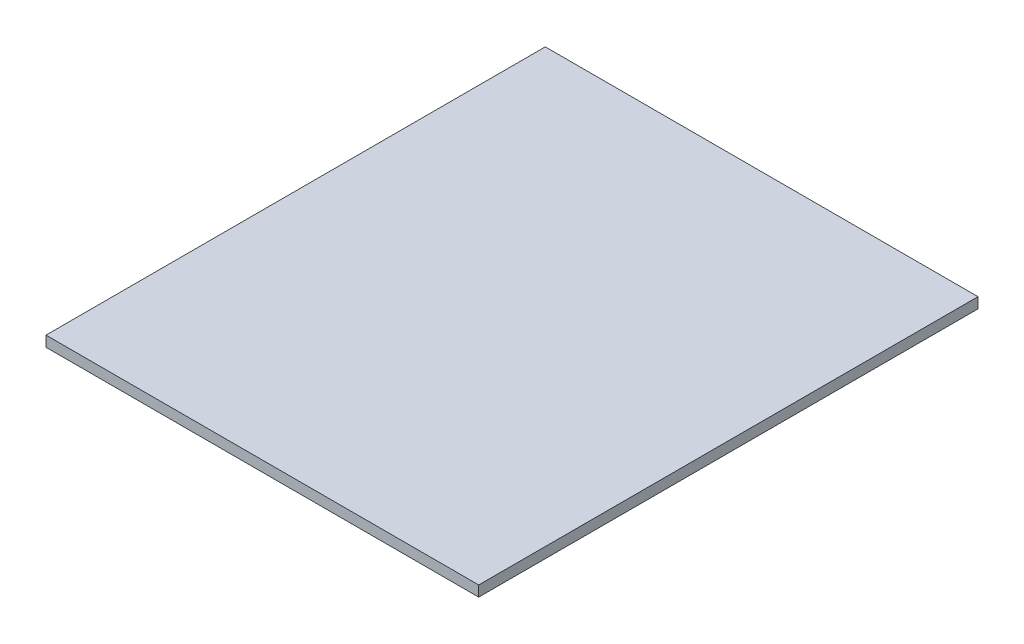
ISO-10303-21;
HEADER;
FILE_DESCRIPTION(('STEP AP214'),'2;1');
FILE_NAME('part.step','',(''),(''),'','','');
FILE_SCHEMA(('AUTOMOTIVE_DESIGN { 1 0 10303 214 1 1 1 1 }'));
ENDSEC;
DATA;
#1=APPLICATION_CONTEXT('core data for automotive mechanical design processes');
#2=APPLICATION_PROTOCOL_DEFINITION('international standard','automotive_design',2000,#1);
#3=PRODUCT_CONTEXT('',#1,'mechanical');
#4=PRODUCT('Part','Part','',(#3));
#5=PRODUCT_RELATED_PRODUCT_CATEGORY('part','',(#4));
#6=PRODUCT_DEFINITION_FORMATION('','',#4);
#7=PRODUCT_DEFINITION_CONTEXT('part definition',#1,'design');
#8=PRODUCT_DEFINITION('design','',#6,#7);
#9=PRODUCT_DEFINITION_SHAPE('','',#8);
#10=(LENGTH_UNIT() NAMED_UNIT(*) SI_UNIT(.MILLI.,.METRE.));
#11=(NAMED_UNIT(*) PLANE_ANGLE_UNIT() SI_UNIT($,.RADIAN.));
#12=(NAMED_UNIT(*) SI_UNIT($,.STERADIAN.) SOLID_ANGLE_UNIT());
#13=UNCERTAINTY_MEASURE_WITH_UNIT(LENGTH_MEASURE(1.E-05),#10,'distance_accuracy_value','');
#14=(GEOMETRIC_REPRESENTATION_CONTEXT(3) GLOBAL_UNCERTAINTY_ASSIGNED_CONTEXT((#13)) GLOBAL_UNIT_ASSIGNED_CONTEXT((#10,
#11,#12)) REPRESENTATION_CONTEXT('',''));
#15=CARTESIAN_POINT('',(0.,0.,0.));
#16=DIRECTION('',(0.,0.,1.));
#17=DIRECTION('',(1.,0.,0.));
#18=AXIS2_PLACEMENT_3D('',#15,#16,#17);
#19=CARTESIAN_POINT('',(0.,3.175,0.));
#20=DIRECTION('',(1.,0.,0.));
#21=DIRECTION('',(0.,0.,-1.));
#22=AXIS2_PLACEMENT_3D('',#19,#20,#21);
#23=PLANE('',#22);
#24=DIRECTION('',(0.,0.,1.));
#25=VECTOR('',#24,1.);
#26=CARTESIAN_POINT('',(0.,0.,0.));
#27=LINE('',#26,#25);
#28=CARTESIAN_POINT('',(0.,0.,-150.));
#29=VERTEX_POINT('',#28);
#30=CARTESIAN_POINT('',(0.,0.,0.));
#31=VERTEX_POINT('',#30);
#32=EDGE_CURVE('E95',#29,#31,#27,.T.);
#33=ORIENTED_EDGE('',*,*,#32,.T.);
#34=DIRECTION('',(0.,-1.,0.));
#35=VECTOR('',#34,1.);
#36=CARTESIAN_POINT('',(0.,3.175,0.));
#37=LINE('',#36,#35);
#38=CARTESIAN_POINT('',(0.,3.175,0.));
#39=VERTEX_POINT('',#38);
#40=EDGE_CURVE('E11',#39,#31,#37,.T.);
#41=ORIENTED_EDGE('',*,*,#40,.F.);
#42=DIRECTION('',(0.,0.,1.));
#43=VECTOR('',#42,1.);
#44=CARTESIAN_POINT('',(0.,3.175,0.));
#45=LINE('',#44,#43);
#46=CARTESIAN_POINT('',(0.,3.175,-150.));
#47=VERTEX_POINT('',#46);
#48=EDGE_CURVE('E83',#47,#39,#45,.T.);
#49=ORIENTED_EDGE('',*,*,#48,.F.);
#50=DIRECTION('',(0.,-1.,0.));
#51=VECTOR('',#50,1.);
#52=CARTESIAN_POINT('',(0.,3.175,-150.));
#53=LINE('',#52,#51);
#54=EDGE_CURVE('E91',#47,#29,#53,.T.);
#55=ORIENTED_EDGE('',*,*,#54,.T.);
#56=EDGE_LOOP('',(#33,#41,#49,#55));
#57=FACE_BOUND('',#56,.T.);
#58=ADVANCED_FACE('F32',(#57),#23,.F.);
#59=CARTESIAN_POINT('',(0.,3.175,0.));
#60=DIRECTION('',(0.,0.,-1.));
#61=DIRECTION('',(-1.,0.,0.));
#62=AXIS2_PLACEMENT_3D('',#59,#60,#61);
#63=PLANE('',#62);
#64=DIRECTION('',(1.,0.,0.));
#65=VECTOR('',#64,1.);
#66=CARTESIAN_POINT('',(0.,0.,0.));
#67=LINE('',#66,#65);
#68=CARTESIAN_POINT('',(130.,0.,0.));
#69=VERTEX_POINT('',#68);
#70=EDGE_CURVE('E87',#31,#69,#67,.T.);
#71=ORIENTED_EDGE('',*,*,#70,.T.);
#72=DIRECTION('',(0.,-1.,0.));
#73=VECTOR('',#72,1.);
#74=CARTESIAN_POINT('',(130.,3.175,0.));
#75=LINE('',#74,#73);
#76=CARTESIAN_POINT('',(130.,3.175,0.));
#77=VERTEX_POINT('',#76);
#78=EDGE_CURVE('E40',#77,#69,#75,.T.);
#79=ORIENTED_EDGE('',*,*,#78,.F.);
#80=DIRECTION('',(1.,0.,0.));
#81=VECTOR('',#80,1.);
#82=CARTESIAN_POINT('',(0.,3.175,0.));
#83=LINE('',#82,#81);
#84=EDGE_CURVE('E78',#39,#77,#83,.T.);
#85=ORIENTED_EDGE('',*,*,#84,.F.);
#86=ORIENTED_EDGE('',*,*,#40,.T.);
#87=EDGE_LOOP('',(#71,#79,#85,#86));
#88=FACE_BOUND('',#87,.T.);
#89=ADVANCED_FACE('F86',(#88),#63,.F.);
#90=CARTESIAN_POINT('',(130.,3.175,0.));
#91=DIRECTION('',(-1.,0.,0.));
#92=DIRECTION('',(0.,0.,1.));
#93=AXIS2_PLACEMENT_3D('',#90,#91,#92);
#94=PLANE('',#93);
#95=DIRECTION('',(0.,0.,-1.));
#96=VECTOR('',#95,1.);
#97=CARTESIAN_POINT('',(130.,0.,0.));
#98=LINE('',#97,#96);
#99=CARTESIAN_POINT('',(130.,0.,-150.));
#100=VERTEX_POINT('',#99);
#101=EDGE_CURVE('E65',#69,#100,#98,.T.);
#102=ORIENTED_EDGE('',*,*,#101,.T.);
#103=DIRECTION('',(0.,-1.,0.));
#104=VECTOR('',#103,1.);
#105=CARTESIAN_POINT('',(130.,3.175,-150.));
#106=LINE('',#105,#104);
#107=CARTESIAN_POINT('',(130.,3.175,-150.));
#108=VERTEX_POINT('',#107);
#109=EDGE_CURVE('E88',#108,#100,#106,.T.);
#110=ORIENTED_EDGE('',*,*,#109,.F.);
#111=DIRECTION('',(0.,0.,-1.));
#112=VECTOR('',#111,1.);
#113=CARTESIAN_POINT('',(130.,3.175,0.));
#114=LINE('',#113,#112);
#115=EDGE_CURVE('E81',#77,#108,#114,.T.);
#116=ORIENTED_EDGE('',*,*,#115,.F.);
#117=ORIENTED_EDGE('',*,*,#78,.T.);
#118=EDGE_LOOP('',(#102,#110,#116,#117));
#119=FACE_BOUND('',#118,.T.);
#120=ADVANCED_FACE('F89',(#119),#94,.F.);
#121=CARTESIAN_POINT('',(0.,3.175,-150.));
#122=DIRECTION('',(0.,0.,1.));
#123=DIRECTION('',(1.,0.,0.));
#124=AXIS2_PLACEMENT_3D('',#121,#122,#123);
#125=PLANE('',#124);
#126=DIRECTION('',(-1.,0.,0.));
#127=VECTOR('',#126,1.);
#128=CARTESIAN_POINT('',(0.,0.,-150.));
#129=LINE('',#128,#127);
#130=EDGE_CURVE('E71',#100,#29,#129,.T.);
#131=ORIENTED_EDGE('',*,*,#130,.T.);
#132=ORIENTED_EDGE('',*,*,#54,.F.);
#133=DIRECTION('',(-1.,0.,0.));
#134=VECTOR('',#133,1.);
#135=CARTESIAN_POINT('',(0.,3.175,-150.));
#136=LINE('',#135,#134);
#137=EDGE_CURVE('E48',#108,#47,#136,.T.);
#138=ORIENTED_EDGE('',*,*,#137,.F.);
#139=ORIENTED_EDGE('',*,*,#109,.T.);
#140=EDGE_LOOP('',(#131,#132,#138,#139));
#141=FACE_BOUND('',#140,.T.);
#142=ADVANCED_FACE('F102',(#141),#125,.F.);
#143=CARTESIAN_POINT('',(0.,3.175,0.));
#144=DIRECTION('',(0.,-1.,0.));
#145=DIRECTION('',(0.,0.,-1.));
#146=AXIS2_PLACEMENT_3D('',#143,#144,#145);
#147=PLANE('',#146);
#148=ORIENTED_EDGE('',*,*,#48,.T.);
#149=ORIENTED_EDGE('',*,*,#84,.T.);
#150=ORIENTED_EDGE('',*,*,#115,.T.);
#151=ORIENTED_EDGE('',*,*,#137,.T.);
#152=EDGE_LOOP('',(#148,#149,#150,#151));
#153=FACE_BOUND('',#152,.T.);
#154=ADVANCED_FACE('F79',(#153),#147,.F.);
#155=CARTESIAN_POINT('',(0.,0.,0.));
#156=DIRECTION('',(0.,-1.,0.));
#157=DIRECTION('',(0.,0.,-1.));
#158=AXIS2_PLACEMENT_3D('',#155,#156,#157);
#159=PLANE('',#158);
#160=ORIENTED_EDGE('',*,*,#32,.F.);
#161=ORIENTED_EDGE('',*,*,#130,.F.);
#162=ORIENTED_EDGE('',*,*,#101,.F.);
#163=ORIENTED_EDGE('',*,*,#70,.F.);
#164=EDGE_LOOP('',(#160,#161,#162,#163));
#165=FACE_BOUND('',#164,.T.);
#166=ADVANCED_FACE('F105',(#165),#159,.T.);
#167=CLOSED_SHELL('',(#58,#89,#120,#142,#154,#166));
#168=MANIFOLD_SOLID_BREP('B2',#167);
#169=ADVANCED_BREP_SHAPE_REPRESENTATION('',(#18,#168),#14);
#170=SHAPE_DEFINITION_REPRESENTATION(#9,#169);
ENDSEC;
END-ISO-10303-21;
